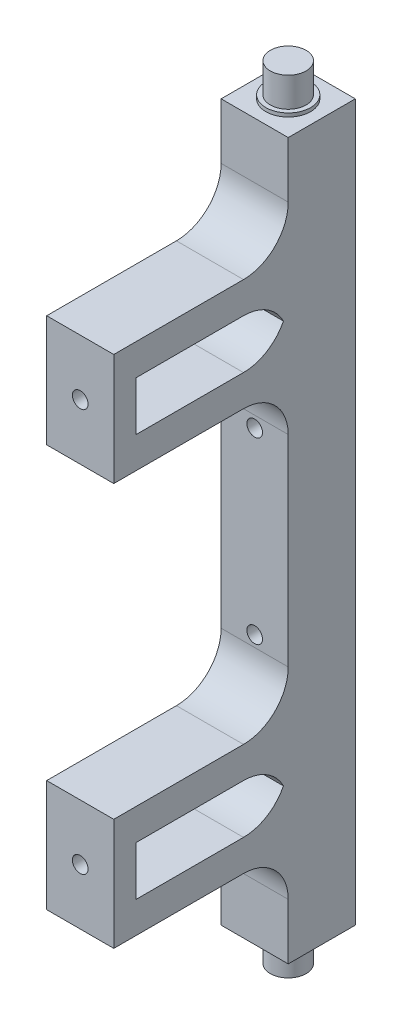
ISO-10303-21;
HEADER;
FILE_DESCRIPTION(('STEP AP214'),'2;1');
FILE_NAME('part.step','',(''),(''),'','','');
FILE_SCHEMA(('AUTOMOTIVE_DESIGN { 1 0 10303 214 1 1 1 1 }'));
ENDSEC;
DATA;
#1=APPLICATION_CONTEXT('core data for automotive mechanical design processes');
#2=APPLICATION_PROTOCOL_DEFINITION('international standard','automotive_design',2000,#1);
#3=PRODUCT_CONTEXT('',#1,'mechanical');
#4=PRODUCT('Part','Part','',(#3));
#5=PRODUCT_RELATED_PRODUCT_CATEGORY('part','',(#4));
#6=PRODUCT_DEFINITION_FORMATION('','',#4);
#7=PRODUCT_DEFINITION_CONTEXT('part definition',#1,'design');
#8=PRODUCT_DEFINITION('design','',#6,#7);
#9=PRODUCT_DEFINITION_SHAPE('','',#8);
#10=(LENGTH_UNIT() NAMED_UNIT(*) SI_UNIT(.MILLI.,.METRE.));
#11=(NAMED_UNIT(*) PLANE_ANGLE_UNIT() SI_UNIT($,.RADIAN.));
#12=(NAMED_UNIT(*) SI_UNIT($,.STERADIAN.) SOLID_ANGLE_UNIT());
#13=UNCERTAINTY_MEASURE_WITH_UNIT(LENGTH_MEASURE(1.E-05),#10,'distance_accuracy_value','');
#14=(GEOMETRIC_REPRESENTATION_CONTEXT(3) GLOBAL_UNCERTAINTY_ASSIGNED_CONTEXT((#13)) GLOBAL_UNIT_ASSIGNED_CONTEXT((#10,
#11,#12)) REPRESENTATION_CONTEXT('',''));
#15=CARTESIAN_POINT('',(0.,0.,0.));
#16=DIRECTION('',(0.,0.,1.));
#17=DIRECTION('',(1.,0.,0.));
#18=AXIS2_PLACEMENT_3D('',#15,#16,#17);
#19=CARTESIAN_POINT('',(0.,0.,0.));
#20=DIRECTION('',(0.,0.,-1.));
#21=DIRECTION('',(-1.,0.,0.));
#22=AXIS2_PLACEMENT_3D('',#19,#20,#21);
#23=PLANE('',#22);
#24=DIRECTION('',(0.,-1.,0.));
#25=VECTOR('',#24,1.);
#26=CARTESIAN_POINT('',(-7.5,-80.,0.));
#27=LINE('',#26,#25);
#28=CARTESIAN_POINT('',(-7.5,80.,0.));
#29=VERTEX_POINT('',#28);
#30=CARTESIAN_POINT('',(-7.5,67.5,0.));
#31=VERTEX_POINT('',#30);
#32=EDGE_CURVE('E341',#29,#31,#27,.T.);
#33=ORIENTED_EDGE('',*,*,#32,.T.);
#34=DIRECTION('',(-1.,0.,0.));
#35=VECTOR('',#34,1.);
#36=CARTESIAN_POINT('',(7.50000000000009,67.5,0.));
#37=LINE('',#36,#35);
#38=CARTESIAN_POINT('',(7.5,67.5,0.));
#39=VERTEX_POINT('',#38);
#40=EDGE_CURVE('E400',#31,#39,#37,.F.);
#41=ORIENTED_EDGE('',*,*,#40,.T.);
#42=DIRECTION('',(0.,1.,0.));
#43=VECTOR('',#42,1.);
#44=CARTESIAN_POINT('',(7.5,-80.,0.));
#45=LINE('',#44,#43);
#46=CARTESIAN_POINT('',(7.5,80.,0.));
#47=VERTEX_POINT('',#46);
#48=EDGE_CURVE('E348',#39,#47,#45,.T.);
#49=ORIENTED_EDGE('',*,*,#48,.T.);
#50=DIRECTION('',(-1.,0.,0.));
#51=VECTOR('',#50,1.);
#52=CARTESIAN_POINT('',(7.5,80.,0.));
#53=LINE('',#52,#51);
#54=EDGE_CURVE('E323',#47,#29,#53,.T.);
#55=ORIENTED_EDGE('',*,*,#54,.T.);
#56=EDGE_LOOP('',(#33,#41,#49,#55));
#57=FACE_BOUND('',#56,.T.);
#58=ADVANCED_FACE('F55',(#57),#23,.F.);
#59=CARTESIAN_POINT('',(0.,20.,0.));
#60=DIRECTION('',(0.,0.,1.));
#61=DIRECTION('',(1.,0.,0.));
#62=AXIS2_PLACEMENT_3D('',#59,#60,#61);
#63=CIRCLE('',#62,1.75);
#64=CARTESIAN_POINT('',(1.75,20.,0.));
#65=VERTEX_POINT('',#64);
#66=EDGE_CURVE('E936',#65,#65,#63,.T.);
#67=ORIENTED_EDGE('',*,*,#66,.F.);
#68=EDGE_LOOP('',(#67));
#69=FACE_BOUND('',#68,.T.);
#70=CARTESIAN_POINT('',(0.,-20.,0.));
#71=DIRECTION('',(0.,0.,1.));
#72=DIRECTION('',(1.,0.,0.));
#73=AXIS2_PLACEMENT_3D('',#70,#71,#72);
#74=CIRCLE('',#73,1.75);
#75=CARTESIAN_POINT('',(1.75,-20.,0.));
#76=VERTEX_POINT('',#75);
#77=EDGE_CURVE('E937',#76,#76,#74,.T.);
#78=ORIENTED_EDGE('',*,*,#77,.F.);
#79=EDGE_LOOP('',(#78));
#80=FACE_BOUND('',#79,.T.);
#81=CARTESIAN_POINT('',(-7.5,22.5,0.));
#82=VERTEX_POINT('',#81);
#83=CARTESIAN_POINT('',(-7.5,-22.5,0.));
#84=VERTEX_POINT('',#83);
#85=EDGE_CURVE('E345',#82,#84,#27,.T.);
#86=ORIENTED_EDGE('',*,*,#85,.T.);
#87=DIRECTION('',(-1.,0.,0.));
#88=VECTOR('',#87,1.);
#89=CARTESIAN_POINT('',(7.49999999999993,-22.4999999999999,0.));
#90=LINE('',#89,#88);
#91=CARTESIAN_POINT('',(7.5,-22.4999999999999,0.));
#92=VERTEX_POINT('',#91);
#93=EDGE_CURVE('E390',#84,#92,#90,.F.);
#94=ORIENTED_EDGE('',*,*,#93,.T.);
#95=CARTESIAN_POINT('',(7.5,22.4999999999999,0.));
#96=VERTEX_POINT('',#95);
#97=EDGE_CURVE('E351',#92,#96,#45,.T.);
#98=ORIENTED_EDGE('',*,*,#97,.T.);
#99=DIRECTION('',(1.,0.,0.));
#100=VECTOR('',#99,1.);
#101=CARTESIAN_POINT('',(-7.50000000000007,22.5,0.));
#102=LINE('',#101,#100);
#103=EDGE_CURVE('E388',#96,#82,#102,.F.);
#104=ORIENTED_EDGE('',*,*,#103,.T.);
#105=EDGE_LOOP('',(#86,#94,#98,#104));
#106=FACE_BOUND('',#105,.T.);
#107=ADVANCED_FACE('F485',(#69,#80,#106),#23,.F.);
#108=CARTESIAN_POINT('',(-7.4999999999999,-32.5,39.));
#109=DIRECTION('',(0.,-1.,0.));
#110=DIRECTION('',(1.,0.,0.));
#111=AXIS2_PLACEMENT_3D('',#108,#109,#110);
#112=PLANE('',#111);
#113=DIRECTION('',(0.,0.,-1.));
#114=VECTOR('',#113,1.);
#115=CARTESIAN_POINT('',(7.5000000000001,-32.4999999999999,39.));
#116=LINE('',#115,#114);
#117=CARTESIAN_POINT('',(7.5000000000001,-32.4999999999999,39.));
#118=VERTEX_POINT('',#117);
#119=CARTESIAN_POINT('',(7.5000000000001,-32.4999999999999,10.));
#120=VERTEX_POINT('',#119);
#121=EDGE_CURVE('E370',#118,#120,#116,.T.);
#122=ORIENTED_EDGE('',*,*,#121,.T.);
#123=DIRECTION('',(-1.,0.,0.));
#124=VECTOR('',#123,1.);
#125=CARTESIAN_POINT('',(-7.5,-32.5,10.));
#126=LINE('',#125,#124);
#127=CARTESIAN_POINT('',(-7.4999999999999,-32.5,10.));
#128=VERTEX_POINT('',#127);
#129=EDGE_CURVE('E385',#120,#128,#126,.T.);
#130=ORIENTED_EDGE('',*,*,#129,.T.);
#131=DIRECTION('',(0.,0.,-1.));
#132=VECTOR('',#131,1.);
#133=CARTESIAN_POINT('',(-7.4999999999999,-32.5,39.));
#134=LINE('',#133,#132);
#135=CARTESIAN_POINT('',(-7.4999999999999,-32.5,39.));
#136=VERTEX_POINT('',#135);
#137=EDGE_CURVE('E379',#136,#128,#134,.T.);
#138=ORIENTED_EDGE('',*,*,#137,.F.);
#139=DIRECTION('',(-1.,0.,0.));
#140=VECTOR('',#139,1.);
#141=CARTESIAN_POINT('',(-7.4999999999999,-32.5,39.));
#142=LINE('',#141,#140);
#143=EDGE_CURVE('E355',#118,#136,#142,.T.);
#144=ORIENTED_EDGE('',*,*,#143,.F.);
#145=EDGE_LOOP('',(#122,#130,#138,#144));
#146=FACE_BOUND('',#145,.T.);
#147=ADVANCED_FACE('F494',(#146),#112,.F.);
#148=CARTESIAN_POINT('',(-7.4999999999999,-57.5,39.));
#149=DIRECTION('',(1.,0.,0.));
#150=DIRECTION('',(0.,0.,-1.));
#151=AXIS2_PLACEMENT_3D('',#148,#149,#150);
#152=PLANE('',#151);
#153=DIRECTION('',(0.,0.,1.));
#154=VECTOR('',#153,1.);
#155=CARTESIAN_POINT('',(-7.4999999999999,-50.5,34.));
#156=LINE('',#155,#154);
#157=CARTESIAN_POINT('',(-7.4999999999999,-50.5,10.));
#158=VERTEX_POINT('',#157);
#159=CARTESIAN_POINT('',(-7.4999999999999,-50.5,34.));
#160=VERTEX_POINT('',#159);
#161=EDGE_CURVE('E241',#158,#160,#156,.T.);
#162=ORIENTED_EDGE('',*,*,#161,.F.);
#163=CARTESIAN_POINT('',(-7.4999999999999,-40.5,10.));
#164=DIRECTION('',(1.,0.,0.));
#165=DIRECTION('',(0.,0.,-1.));
#166=AXIS2_PLACEMENT_3D('',#163,#164,#165);
#167=CIRCLE('',#166,10.);
#168=CARTESIAN_POINT('',(-7.4999999999999,-45.,1.06971445025412));
#169=VERTEX_POINT('',#168);
#170=EDGE_CURVE('E64',#158,#169,#167,.T.);
#171=ORIENTED_EDGE('',*,*,#170,.T.);
#172=CARTESIAN_POINT('',(-7.4999999999999,-49.5,10.));
#173=DIRECTION('',(1.,0.,0.));
#174=DIRECTION('',(0.,0.,-1.));
#175=AXIS2_PLACEMENT_3D('',#172,#173,#174);
#176=CIRCLE('',#175,10.);
#177=CARTESIAN_POINT('',(-7.4999999999999,-39.5,9.99999999999999));
#178=VERTEX_POINT('',#177);
#179=EDGE_CURVE('E439',#169,#178,#176,.T.);
#180=ORIENTED_EDGE('',*,*,#179,.T.);
#181=DIRECTION('',(0.,0.,-1.));
#182=VECTOR('',#181,1.);
#183=CARTESIAN_POINT('',(-7.4999999999999,-39.5,34.));
#184=LINE('',#183,#182);
#185=CARTESIAN_POINT('',(-7.4999999999999,-39.5,34.));
#186=VERTEX_POINT('',#185);
#187=EDGE_CURVE('E252',#186,#178,#184,.T.);
#188=ORIENTED_EDGE('',*,*,#187,.F.);
#189=DIRECTION('',(0.,1.,0.));
#190=VECTOR('',#189,1.);
#191=CARTESIAN_POINT('',(-7.4999999999999,-39.5,34.));
#192=LINE('',#191,#190);
#193=EDGE_CURVE('E257',#160,#186,#192,.T.);
#194=ORIENTED_EDGE('',*,*,#193,.F.);
#195=EDGE_LOOP('',(#162,#171,#180,#188,#194));
#196=FACE_BOUND('',#195,.T.);
#197=DIRECTION('',(0.,0.,-1.));
#198=VECTOR('',#197,1.);
#199=CARTESIAN_POINT('',(-7.4999999999999,50.5,34.));
#200=LINE('',#199,#198);
#201=CARTESIAN_POINT('',(-7.4999999999999,50.5,34.));
#202=VERTEX_POINT('',#201);
#203=CARTESIAN_POINT('',(-7.4999999999999,50.5,9.99999999999999));
#204=VERTEX_POINT('',#203);
#205=EDGE_CURVE('E271',#202,#204,#200,.T.);
#206=ORIENTED_EDGE('',*,*,#205,.F.);
#207=DIRECTION('',(0.,1.,0.));
#208=VECTOR('',#207,1.);
#209=CARTESIAN_POINT('',(-7.4999999999999,39.5,34.));
#210=LINE('',#209,#208);
#211=CARTESIAN_POINT('',(-7.4999999999999,39.5,34.));
#212=VERTEX_POINT('',#211);
#213=EDGE_CURVE('E255',#212,#202,#210,.T.);
#214=ORIENTED_EDGE('',*,*,#213,.F.);
#215=DIRECTION('',(0.,0.,1.));
#216=VECTOR('',#215,1.);
#217=CARTESIAN_POINT('',(-7.4999999999999,39.5,34.));
#218=LINE('',#217,#216);
#219=CARTESIAN_POINT('',(-7.4999999999999,39.5,10.));
#220=VERTEX_POINT('',#219);
#221=EDGE_CURVE('E269',#220,#212,#218,.T.);
#222=ORIENTED_EDGE('',*,*,#221,.F.);
#223=CARTESIAN_POINT('',(-7.4999999999999,49.5,10.));
#224=DIRECTION('',(1.,0.,0.));
#225=DIRECTION('',(0.,0.,-1.));
#226=AXIS2_PLACEMENT_3D('',#223,#224,#225);
#227=CIRCLE('',#226,10.);
#228=CARTESIAN_POINT('',(-7.4999999999999,45.,1.06971445025412));
#229=VERTEX_POINT('',#228);
#230=EDGE_CURVE('E431',#220,#229,#227,.T.);
#231=ORIENTED_EDGE('',*,*,#230,.T.);
#232=CARTESIAN_POINT('',(-7.4999999999999,40.5,10.));
#233=DIRECTION('',(1.,0.,0.));
#234=DIRECTION('',(0.,0.,-1.));
#235=AXIS2_PLACEMENT_3D('',#232,#233,#234);
#236=CIRCLE('',#235,10.);
#237=EDGE_CURVE('E435',#229,#204,#236,.T.);
#238=ORIENTED_EDGE('',*,*,#237,.T.);
#239=EDGE_LOOP('',(#206,#214,#222,#231,#238));
#240=FACE_BOUND('',#239,.T.);
#241=ORIENTED_EDGE('',*,*,#137,.T.);
#242=CARTESIAN_POINT('',(-7.4999999999999,-22.5,10.));
#243=DIRECTION('',(1.,0.,0.));
#244=DIRECTION('',(0.,0.,-1.));
#245=AXIS2_PLACEMENT_3D('',#242,#243,#244);
#246=CIRCLE('',#245,10.);
#247=EDGE_CURVE('E405',#128,#84,#246,.T.);
#248=ORIENTED_EDGE('',*,*,#247,.T.);
#249=ORIENTED_EDGE('',*,*,#85,.F.);
#250=CARTESIAN_POINT('',(-7.4999999999999,22.5,10.));
#251=DIRECTION('',(1.,0.,0.));
#252=DIRECTION('',(0.,0.,-1.));
#253=AXIS2_PLACEMENT_3D('',#250,#251,#252);
#254=CIRCLE('',#253,10.);
#255=CARTESIAN_POINT('',(-7.49999999999991,32.5,10.));
#256=VERTEX_POINT('',#255);
#257=EDGE_CURVE('E419',#82,#256,#254,.T.);
#258=ORIENTED_EDGE('',*,*,#257,.T.);
#259=DIRECTION('',(0.,0.,-1.));
#260=VECTOR('',#259,1.);
#261=CARTESIAN_POINT('',(-7.49999999999991,32.5,39.));
#262=LINE('',#261,#260);
#263=CARTESIAN_POINT('',(-7.49999999999991,32.5,39.));
#264=VERTEX_POINT('',#263);
#265=EDGE_CURVE('E305',#264,#256,#262,.T.);
#266=ORIENTED_EDGE('',*,*,#265,.F.);
#267=DIRECTION('',(0.,-1.,0.));
#268=VECTOR('',#267,1.);
#269=CARTESIAN_POINT('',(-7.49999999999991,57.5,39.));
#270=LINE('',#269,#268);
#271=CARTESIAN_POINT('',(-7.49999999999991,57.5,39.));
#272=VERTEX_POINT('',#271);
#273=EDGE_CURVE('E318',#272,#264,#270,.T.);
#274=ORIENTED_EDGE('',*,*,#273,.F.);
#275=DIRECTION('',(0.,0.,-1.));
#276=VECTOR('',#275,1.);
#277=CARTESIAN_POINT('',(-7.49999999999991,57.5,39.));
#278=LINE('',#277,#276);
#279=CARTESIAN_POINT('',(-7.49999999999991,57.5,10.));
#280=VERTEX_POINT('',#279);
#281=EDGE_CURVE('E300',#272,#280,#278,.T.);
#282=ORIENTED_EDGE('',*,*,#281,.T.);
#283=CARTESIAN_POINT('',(-7.4999999999999,67.5,10.));
#284=DIRECTION('',(1.,0.,0.));
#285=DIRECTION('',(0.,0.,-1.));
#286=AXIS2_PLACEMENT_3D('',#283,#284,#285);
#287=CIRCLE('',#286,10.);
#288=EDGE_CURVE('E413',#280,#31,#287,.T.);
#289=ORIENTED_EDGE('',*,*,#288,.T.);
#290=ORIENTED_EDGE('',*,*,#32,.F.);
#291=DIRECTION('',(0.,0.,1.));
#292=VECTOR('',#291,1.);
#293=CARTESIAN_POINT('',(-7.5,80.,-15.));
#294=LINE('',#293,#292);
#295=CARTESIAN_POINT('',(-7.5,80.,-15.));
#296=VERTEX_POINT('',#295);
#297=EDGE_CURVE('E337',#296,#29,#294,.T.);
#298=ORIENTED_EDGE('',*,*,#297,.F.);
#299=DIRECTION('',(0.,-1.,0.));
#300=VECTOR('',#299,1.);
#301=CARTESIAN_POINT('',(-7.5,-80.,-15.));
#302=LINE('',#301,#300);
#303=CARTESIAN_POINT('',(-7.5,-80.,-15.));
#304=VERTEX_POINT('',#303);
#305=EDGE_CURVE('E327',#296,#304,#302,.T.);
#306=ORIENTED_EDGE('',*,*,#305,.T.);
#307=DIRECTION('',(0.,0.,1.));
#308=VECTOR('',#307,1.);
#309=CARTESIAN_POINT('',(-7.5,-80.,-15.));
#310=LINE('',#309,#308);
#311=CARTESIAN_POINT('',(-7.5,-80.,0.));
#312=VERTEX_POINT('',#311);
#313=EDGE_CURVE('E358',#304,#312,#310,.T.);
#314=ORIENTED_EDGE('',*,*,#313,.T.);
#315=CARTESIAN_POINT('',(-7.5,-67.5,0.));
#316=VERTEX_POINT('',#315);
#317=EDGE_CURVE('E340',#316,#312,#27,.T.);
#318=ORIENTED_EDGE('',*,*,#317,.F.);
#319=CARTESIAN_POINT('',(-7.4999999999999,-67.5,10.));
#320=DIRECTION('',(1.,0.,0.));
#321=DIRECTION('',(0.,0.,-1.));
#322=AXIS2_PLACEMENT_3D('',#319,#320,#321);
#323=CIRCLE('',#322,10.);
#324=CARTESIAN_POINT('',(-7.4999999999999,-57.5,10.));
#325=VERTEX_POINT('',#324);
#326=EDGE_CURVE('E411',#316,#325,#323,.T.);
#327=ORIENTED_EDGE('',*,*,#326,.T.);
#328=DIRECTION('',(0.,0.,-1.));
#329=VECTOR('',#328,1.);
#330=CARTESIAN_POINT('',(-7.4999999999999,-57.5,39.));
#331=LINE('',#330,#329);
#332=CARTESIAN_POINT('',(-7.4999999999999,-57.5,39.));
#333=VERTEX_POINT('',#332);
#334=EDGE_CURVE('E376',#333,#325,#331,.T.);
#335=ORIENTED_EDGE('',*,*,#334,.F.);
#336=DIRECTION('',(0.,-1.,0.));
#337=VECTOR('',#336,1.);
#338=CARTESIAN_POINT('',(-7.4999999999999,-57.5,39.));
#339=LINE('',#338,#337);
#340=EDGE_CURVE('E364',#136,#333,#339,.T.);
#341=ORIENTED_EDGE('',*,*,#340,.F.);
#342=EDGE_LOOP('',(#241,#248,#249,#258,#266,#274,#282,#289,#290,#298,#306,#314,#318,#327,#335,#341));
#343=FACE_BOUND('',#342,.T.);
#344=ADVANCED_FACE('F472',(#196,#240,#343),#152,.F.);
#345=CARTESIAN_POINT('',(-7.4999999999999,-57.5,39.));
#346=DIRECTION('',(0.,1.,0.));
#347=DIRECTION('',(0.,0.,1.));
#348=AXIS2_PLACEMENT_3D('',#345,#346,#347);
#349=PLANE('',#348);
#350=ORIENTED_EDGE('',*,*,#334,.T.);
#351=DIRECTION('',(1.,0.,0.));
#352=VECTOR('',#351,1.);
#353=CARTESIAN_POINT('',(7.5000000000001,-57.5,10.));
#354=LINE('',#353,#352);
#355=CARTESIAN_POINT('',(7.5000000000001,-57.5,10.));
#356=VERTEX_POINT('',#355);
#357=EDGE_CURVE('E392',#325,#356,#354,.T.);
#358=ORIENTED_EDGE('',*,*,#357,.T.);
#359=DIRECTION('',(0.,0.,-1.));
#360=VECTOR('',#359,1.);
#361=CARTESIAN_POINT('',(7.5000000000001,-57.5,39.));
#362=LINE('',#361,#360);
#363=CARTESIAN_POINT('',(7.5000000000001,-57.5,39.));
#364=VERTEX_POINT('',#363);
#365=EDGE_CURVE('E373',#364,#356,#362,.T.);
#366=ORIENTED_EDGE('',*,*,#365,.F.);
#367=DIRECTION('',(1.,0.,0.));
#368=VECTOR('',#367,1.);
#369=CARTESIAN_POINT('',(-7.4999999999999,-57.5,39.));
#370=LINE('',#369,#368);
#371=EDGE_CURVE('E366',#333,#364,#370,.T.);
#372=ORIENTED_EDGE('',*,*,#371,.F.);
#373=EDGE_LOOP('',(#350,#358,#366,#372));
#374=FACE_BOUND('',#373,.T.);
#375=ADVANCED_FACE('F525',(#374),#349,.F.);
#376=CARTESIAN_POINT('',(7.5000000000001,-57.5,39.));
#377=DIRECTION('',(-1.,0.,0.));
#378=DIRECTION('',(0.,0.,1.));
#379=AXIS2_PLACEMENT_3D('',#376,#377,#378);
#380=PLANE('',#379);
#381=DIRECTION('',(0.,1.,0.));
#382=VECTOR('',#381,1.);
#383=CARTESIAN_POINT('',(7.5000000000001,-39.5,34.));
#384=LINE('',#383,#382);
#385=CARTESIAN_POINT('',(7.5000000000001,-50.5,34.));
#386=VERTEX_POINT('',#385);
#387=CARTESIAN_POINT('',(7.5000000000001,-39.5,34.));
#388=VERTEX_POINT('',#387);
#389=EDGE_CURVE('E233',#386,#388,#384,.T.);
#390=ORIENTED_EDGE('',*,*,#389,.T.);
#391=DIRECTION('',(0.,0.,-1.));
#392=VECTOR('',#391,1.);
#393=CARTESIAN_POINT('',(7.5000000000001,-39.5,34.));
#394=LINE('',#393,#392);
#395=CARTESIAN_POINT('',(7.5000000000001,-39.5,9.99999999999999));
#396=VERTEX_POINT('',#395);
#397=EDGE_CURVE('E236',#388,#396,#394,.T.);
#398=ORIENTED_EDGE('',*,*,#397,.T.);
#399=CARTESIAN_POINT('',(7.5000000000001,-49.5,10.));
#400=DIRECTION('',(-1.,0.,0.));
#401=DIRECTION('',(0.,0.,1.));
#402=AXIS2_PLACEMENT_3D('',#399,#400,#401);
#403=CIRCLE('',#402,10.);
#404=CARTESIAN_POINT('',(7.5000000000001,-45.,1.06971445025412));
#405=VERTEX_POINT('',#404);
#406=EDGE_CURVE('E71',#396,#405,#403,.T.);
#407=ORIENTED_EDGE('',*,*,#406,.T.);
#408=CARTESIAN_POINT('',(7.5000000000001,-40.5,10.));
#409=DIRECTION('',(-1.,0.,0.));
#410=DIRECTION('',(0.,0.,1.));
#411=AXIS2_PLACEMENT_3D('',#408,#409,#410);
#412=CIRCLE('',#411,10.);
#413=CARTESIAN_POINT('',(7.5000000000001,-50.5,10.));
#414=VERTEX_POINT('',#413);
#415=EDGE_CURVE('E12',#405,#414,#412,.T.);
#416=ORIENTED_EDGE('',*,*,#415,.T.);
#417=DIRECTION('',(0.,0.,1.));
#418=VECTOR('',#417,1.);
#419=CARTESIAN_POINT('',(7.5000000000001,-50.5,34.));
#420=LINE('',#419,#418);
#421=EDGE_CURVE('E228',#414,#386,#420,.T.);
#422=ORIENTED_EDGE('',*,*,#421,.T.);
#423=EDGE_LOOP('',(#390,#398,#407,#416,#422));
#424=FACE_BOUND('',#423,.T.);
#425=DIRECTION('',(0.,0.,-1.));
#426=VECTOR('',#425,1.);
#427=CARTESIAN_POINT('',(7.5000000000001,50.5,34.));
#428=LINE('',#427,#426);
#429=CARTESIAN_POINT('',(7.5000000000001,50.5,34.));
#430=VERTEX_POINT('',#429);
#431=CARTESIAN_POINT('',(7.5000000000001,50.5,9.99999999999999));
#432=VERTEX_POINT('',#431);
#433=EDGE_CURVE('E277',#430,#432,#428,.T.);
#434=ORIENTED_EDGE('',*,*,#433,.T.);
#435=CARTESIAN_POINT('',(7.5000000000001,40.5,10.));
#436=DIRECTION('',(-1.,0.,0.));
#437=DIRECTION('',(0.,0.,1.));
#438=AXIS2_PLACEMENT_3D('',#435,#436,#437);
#439=CIRCLE('',#438,10.);
#440=CARTESIAN_POINT('',(7.5000000000001,45.,1.06971445025412));
#441=VERTEX_POINT('',#440);
#442=EDGE_CURVE('E437',#432,#441,#439,.T.);
#443=ORIENTED_EDGE('',*,*,#442,.T.);
#444=CARTESIAN_POINT('',(7.5000000000001,49.5,10.));
#445=DIRECTION('',(-1.,0.,0.));
#446=DIRECTION('',(0.,0.,1.));
#447=AXIS2_PLACEMENT_3D('',#444,#445,#446);
#448=CIRCLE('',#447,10.);
#449=CARTESIAN_POINT('',(7.5000000000001,39.5,10.));
#450=VERTEX_POINT('',#449);
#451=EDGE_CURVE('E433',#441,#450,#448,.T.);
#452=ORIENTED_EDGE('',*,*,#451,.T.);
#453=DIRECTION('',(0.,0.,1.));
#454=VECTOR('',#453,1.);
#455=CARTESIAN_POINT('',(7.5000000000001,39.5,34.));
#456=LINE('',#455,#454);
#457=CARTESIAN_POINT('',(7.5000000000001,39.5,34.));
#458=VERTEX_POINT('',#457);
#459=EDGE_CURVE('E264',#450,#458,#456,.T.);
#460=ORIENTED_EDGE('',*,*,#459,.T.);
#461=DIRECTION('',(0.,1.,0.));
#462=VECTOR('',#461,1.);
#463=CARTESIAN_POINT('',(7.5000000000001,39.5,34.));
#464=LINE('',#463,#462);
#465=EDGE_CURVE('E272',#458,#430,#464,.T.);
#466=ORIENTED_EDGE('',*,*,#465,.T.);
#467=EDGE_LOOP('',(#434,#443,#452,#460,#466));
#468=FACE_BOUND('',#467,.T.);
#469=ORIENTED_EDGE('',*,*,#365,.T.);
#470=CARTESIAN_POINT('',(7.5000000000001,-67.5,10.));
#471=DIRECTION('',(-1.,0.,0.));
#472=DIRECTION('',(0.,0.,1.));
#473=AXIS2_PLACEMENT_3D('',#470,#471,#472);
#474=CIRCLE('',#473,10.);
#475=CARTESIAN_POINT('',(7.5,-67.5,0.));
#476=VERTEX_POINT('',#475);
#477=EDGE_CURVE('E409',#356,#476,#474,.T.);
#478=ORIENTED_EDGE('',*,*,#477,.T.);
#479=CARTESIAN_POINT('',(7.5,-80.,0.));
#480=VERTEX_POINT('',#479);
#481=EDGE_CURVE('E328',#480,#476,#45,.T.);
#482=ORIENTED_EDGE('',*,*,#481,.F.);
#483=DIRECTION('',(0.,0.,1.));
#484=VECTOR('',#483,1.);
#485=CARTESIAN_POINT('',(7.5,-80.,-15.));
#486=LINE('',#485,#484);
#487=CARTESIAN_POINT('',(7.5,-80.,-15.));
#488=VERTEX_POINT('',#487);
#489=EDGE_CURVE('E356',#488,#480,#486,.T.);
#490=ORIENTED_EDGE('',*,*,#489,.F.);
#491=DIRECTION('',(0.,1.,0.));
#492=VECTOR('',#491,1.);
#493=CARTESIAN_POINT('',(7.5,-80.,-15.));
#494=LINE('',#493,#492);
#495=CARTESIAN_POINT('',(7.5,80.,-15.));
#496=VERTEX_POINT('',#495);
#497=EDGE_CURVE('E334',#488,#496,#494,.T.);
#498=ORIENTED_EDGE('',*,*,#497,.T.);
#499=DIRECTION('',(0.,0.,1.));
#500=VECTOR('',#499,1.);
#501=CARTESIAN_POINT('',(7.5,80.,-15.));
#502=LINE('',#501,#500);
#503=EDGE_CURVE('E352',#496,#47,#502,.T.);
#504=ORIENTED_EDGE('',*,*,#503,.T.);
#505=ORIENTED_EDGE('',*,*,#48,.F.);
#506=CARTESIAN_POINT('',(7.5000000000001,67.5,10.));
#507=DIRECTION('',(-1.,0.,0.));
#508=DIRECTION('',(0.,0.,1.));
#509=AXIS2_PLACEMENT_3D('',#506,#507,#508);
#510=CIRCLE('',#509,10.);
#511=CARTESIAN_POINT('',(7.50000000000009,57.5,10.));
#512=VERTEX_POINT('',#511);
#513=EDGE_CURVE('E415',#39,#512,#510,.T.);
#514=ORIENTED_EDGE('',*,*,#513,.T.);
#515=DIRECTION('',(0.,0.,-1.));
#516=VECTOR('',#515,1.);
#517=CARTESIAN_POINT('',(7.50000000000009,57.5,39.));
#518=LINE('',#517,#516);
#519=CARTESIAN_POINT('',(7.50000000000009,57.5,39.));
#520=VERTEX_POINT('',#519);
#521=EDGE_CURVE('E311',#520,#512,#518,.T.);
#522=ORIENTED_EDGE('',*,*,#521,.F.);
#523=DIRECTION('',(0.,1.,0.));
#524=VECTOR('',#523,1.);
#525=CARTESIAN_POINT('',(7.50000000000009,57.5,39.));
#526=LINE('',#525,#524);
#527=CARTESIAN_POINT('',(7.50000000000009,32.4999999999999,39.));
#528=VERTEX_POINT('',#527);
#529=EDGE_CURVE('E314',#528,#520,#526,.T.);
#530=ORIENTED_EDGE('',*,*,#529,.F.);
#531=DIRECTION('',(0.,0.,-1.));
#532=VECTOR('',#531,1.);
#533=CARTESIAN_POINT('',(7.50000000000009,32.4999999999999,39.));
#534=LINE('',#533,#532);
#535=CARTESIAN_POINT('',(7.50000000000009,32.4999999999999,10.));
#536=VERTEX_POINT('',#535);
#537=EDGE_CURVE('E308',#528,#536,#534,.T.);
#538=ORIENTED_EDGE('',*,*,#537,.T.);
#539=CARTESIAN_POINT('',(7.5000000000001,22.4999999999999,10.));
#540=DIRECTION('',(-1.,0.,0.));
#541=DIRECTION('',(0.,0.,1.));
#542=AXIS2_PLACEMENT_3D('',#539,#540,#541);
#543=CIRCLE('',#542,10.);
#544=EDGE_CURVE('E417',#536,#96,#543,.T.);
#545=ORIENTED_EDGE('',*,*,#544,.T.);
#546=ORIENTED_EDGE('',*,*,#97,.F.);
#547=CARTESIAN_POINT('',(7.5000000000001,-22.4999999999999,10.));
#548=DIRECTION('',(-1.,0.,0.));
#549=DIRECTION('',(0.,0.,1.));
#550=AXIS2_PLACEMENT_3D('',#547,#548,#549);
#551=CIRCLE('',#550,10.);
#552=EDGE_CURVE('E407',#92,#120,#551,.T.);
#553=ORIENTED_EDGE('',*,*,#552,.T.);
#554=ORIENTED_EDGE('',*,*,#121,.F.);
#555=DIRECTION('',(0.,1.,0.));
#556=VECTOR('',#555,1.);
#557=CARTESIAN_POINT('',(7.5000000000001,-57.5,39.));
#558=LINE('',#557,#556);
#559=EDGE_CURVE('E368',#364,#118,#558,.T.);
#560=ORIENTED_EDGE('',*,*,#559,.F.);
#561=EDGE_LOOP('',(#469,#478,#482,#490,#498,#504,#505,#514,#522,#530,#538,#545,#546,#553,#554,#560));
#562=FACE_BOUND('',#561,.T.);
#563=ADVANCED_FACE('F230',(#424,#468,#562),#380,.F.);
#564=CARTESIAN_POINT('',(0.,0.,39.));
#565=DIRECTION('',(0.,0.,1.));
#566=DIRECTION('',(1.,0.,0.));
#567=AXIS2_PLACEMENT_3D('',#564,#565,#566);
#568=PLANE('',#567);
#569=CARTESIAN_POINT('',(0.,-44.9999999999999,39.));
#570=DIRECTION('',(0.,0.,-1.));
#571=DIRECTION('',(-1.,0.,0.));
#572=AXIS2_PLACEMENT_3D('',#569,#570,#571);
#573=CIRCLE('',#572,1.75);
#574=CARTESIAN_POINT('',(-1.75,-44.9999999999999,39.));
#575=VERTEX_POINT('',#574);
#576=EDGE_CURVE('E447',#575,#575,#573,.T.);
#577=ORIENTED_EDGE('',*,*,#576,.T.);
#578=EDGE_LOOP('',(#577));
#579=FACE_BOUND('',#578,.T.);
#580=ORIENTED_EDGE('',*,*,#143,.T.);
#581=ORIENTED_EDGE('',*,*,#340,.T.);
#582=ORIENTED_EDGE('',*,*,#371,.T.);
#583=ORIENTED_EDGE('',*,*,#559,.T.);
#584=EDGE_LOOP('',(#580,#581,#582,#583));
#585=FACE_BOUND('',#584,.T.);
#586=ADVANCED_FACE('F529',(#579,#585),#568,.T.);
#587=CARTESIAN_POINT('',(7.5,80.,-15.));
#588=DIRECTION('',(0.,1.,0.));
#589=DIRECTION('',(0.,0.,1.));
#590=AXIS2_PLACEMENT_3D('',#587,#588,#589);
#591=PLANE('',#590);
#592=CARTESIAN_POINT('',(0.,80.,-7.5));
#593=DIRECTION('',(0.,1.,0.));
#594=DIRECTION('',(0.,0.,1.));
#595=AXIS2_PLACEMENT_3D('',#592,#593,#594);
#596=CIRCLE('',#595,5.);
#597=CARTESIAN_POINT('',(0.,80.,-2.5));
#598=VERTEX_POINT('',#597);
#599=EDGE_CURVE('E382',#598,#598,#596,.T.);
#600=ORIENTED_EDGE('',*,*,#599,.F.);
#601=EDGE_LOOP('',(#600));
#602=FACE_BOUND('',#601,.T.);
#603=ORIENTED_EDGE('',*,*,#54,.F.);
#604=ORIENTED_EDGE('',*,*,#503,.F.);
#605=DIRECTION('',(-1.,0.,0.));
#606=VECTOR('',#605,1.);
#607=CARTESIAN_POINT('',(7.5,80.,-15.));
#608=LINE('',#607,#606);
#609=EDGE_CURVE('E324',#496,#296,#608,.T.);
#610=ORIENTED_EDGE('',*,*,#609,.T.);
#611=ORIENTED_EDGE('',*,*,#297,.T.);
#612=EDGE_LOOP('',(#603,#604,#610,#611));
#613=FACE_BOUND('',#612,.T.);
#614=ADVANCED_FACE('F552',(#602,#613),#591,.T.);
#615=CARTESIAN_POINT('',(7.5,-80.,-15.));
#616=DIRECTION('',(0.,-1.,0.));
#617=DIRECTION('',(0.,0.,-1.));
#618=AXIS2_PLACEMENT_3D('',#615,#616,#617);
#619=PLANE('',#618);
#620=CARTESIAN_POINT('',(0.,-80.,-7.5));
#621=DIRECTION('',(0.,-1.,0.));
#622=DIRECTION('',(0.,0.,-1.));
#623=AXIS2_PLACEMENT_3D('',#620,#621,#622);
#624=CIRCLE('',#623,5.);
#625=CARTESIAN_POINT('',(0.,-80.,-12.5));
#626=VERTEX_POINT('',#625);
#627=EDGE_CURVE('E296',#626,#626,#624,.T.);
#628=ORIENTED_EDGE('',*,*,#627,.F.);
#629=EDGE_LOOP('',(#628));
#630=FACE_BOUND('',#629,.T.);
#631=DIRECTION('',(1.,0.,0.));
#632=VECTOR('',#631,1.);
#633=CARTESIAN_POINT('',(7.5,-80.,0.));
#634=LINE('',#633,#632);
#635=EDGE_CURVE('E344',#312,#480,#634,.T.);
#636=ORIENTED_EDGE('',*,*,#635,.F.);
#637=ORIENTED_EDGE('',*,*,#313,.F.);
#638=DIRECTION('',(1.,0.,0.));
#639=VECTOR('',#638,1.);
#640=CARTESIAN_POINT('',(7.5,-80.,-15.));
#641=LINE('',#640,#639);
#642=EDGE_CURVE('E331',#304,#488,#641,.T.);
#643=ORIENTED_EDGE('',*,*,#642,.T.);
#644=ORIENTED_EDGE('',*,*,#489,.T.);
#645=EDGE_LOOP('',(#636,#637,#643,#644));
#646=FACE_BOUND('',#645,.T.);
#647=ADVANCED_FACE('F510',(#630,#646),#619,.T.);
#648=CARTESIAN_POINT('',(0.,0.,-15.));
#649=DIRECTION('',(0.,0.,-1.));
#650=DIRECTION('',(-1.,0.,0.));
#651=AXIS2_PLACEMENT_3D('',#648,#649,#650);
#652=PLANE('',#651);
#653=CARTESIAN_POINT('',(0.,20.,-15.));
#654=DIRECTION('',(0.,0.,1.));
#655=DIRECTION('',(1.,0.,0.));
#656=AXIS2_PLACEMENT_3D('',#653,#654,#655);
#657=CIRCLE('',#656,1.75);
#658=CARTESIAN_POINT('',(1.75,20.,-15.));
#659=VERTEX_POINT('',#658);
#660=EDGE_CURVE('E466',#659,#659,#657,.T.);
#661=ORIENTED_EDGE('',*,*,#660,.T.);
#662=EDGE_LOOP('',(#661));
#663=FACE_BOUND('',#662,.T.);
#664=CARTESIAN_POINT('',(0.,-20.,-15.));
#665=DIRECTION('',(0.,0.,1.));
#666=DIRECTION('',(1.,0.,0.));
#667=AXIS2_PLACEMENT_3D('',#664,#665,#666);
#668=CIRCLE('',#667,1.75);
#669=CARTESIAN_POINT('',(1.75,-20.,-15.));
#670=VERTEX_POINT('',#669);
#671=EDGE_CURVE('E459',#670,#670,#668,.T.);
#672=ORIENTED_EDGE('',*,*,#671,.T.);
#673=EDGE_LOOP('',(#672));
#674=FACE_BOUND('',#673,.T.);
#675=ORIENTED_EDGE('',*,*,#609,.F.);
#676=ORIENTED_EDGE('',*,*,#497,.F.);
#677=ORIENTED_EDGE('',*,*,#642,.F.);
#678=ORIENTED_EDGE('',*,*,#305,.F.);
#679=EDGE_LOOP('',(#675,#676,#677,#678));
#680=FACE_BOUND('',#679,.T.);
#681=ADVANCED_FACE('F500',(#663,#674,#680),#652,.T.);
#682=ORIENTED_EDGE('',*,*,#481,.T.);
#683=DIRECTION('',(1.,0.,0.));
#684=VECTOR('',#683,1.);
#685=CARTESIAN_POINT('',(-7.5,-67.5,0.));
#686=LINE('',#685,#684);
#687=EDGE_CURVE('E395',#476,#316,#686,.F.);
#688=ORIENTED_EDGE('',*,*,#687,.T.);
#689=ORIENTED_EDGE('',*,*,#317,.T.);
#690=ORIENTED_EDGE('',*,*,#635,.T.);
#691=EDGE_LOOP('',(#682,#688,#689,#690));
#692=FACE_BOUND('',#691,.T.);
#693=ADVANCED_FACE('F488',(#692),#23,.F.);
#694=CARTESIAN_POINT('',(-7.49999999999991,57.5,39.));
#695=DIRECTION('',(0.,-1.,0.));
#696=DIRECTION('',(0.,0.,-1.));
#697=AXIS2_PLACEMENT_3D('',#694,#695,#696);
#698=PLANE('',#697);
#699=ORIENTED_EDGE('',*,*,#521,.T.);
#700=DIRECTION('',(-1.,0.,0.));
#701=VECTOR('',#700,1.);
#702=CARTESIAN_POINT('',(-7.5,57.5,10.));
#703=LINE('',#702,#701);
#704=EDGE_CURVE('E397',#512,#280,#703,.T.);
#705=ORIENTED_EDGE('',*,*,#704,.T.);
#706=ORIENTED_EDGE('',*,*,#281,.F.);
#707=DIRECTION('',(-1.,0.,0.));
#708=VECTOR('',#707,1.);
#709=CARTESIAN_POINT('',(-7.49999999999991,57.5,39.));
#710=LINE('',#709,#708);
#711=EDGE_CURVE('E320',#520,#272,#710,.T.);
#712=ORIENTED_EDGE('',*,*,#711,.F.);
#713=EDGE_LOOP('',(#699,#705,#706,#712));
#714=FACE_BOUND('',#713,.T.);
#715=ADVANCED_FACE('F499',(#714),#698,.F.);
#716=CARTESIAN_POINT('',(-7.49999999999991,32.5,39.));
#717=DIRECTION('',(0.,1.,0.));
#718=DIRECTION('',(-1.,0.,0.));
#719=AXIS2_PLACEMENT_3D('',#716,#717,#718);
#720=PLANE('',#719);
#721=ORIENTED_EDGE('',*,*,#265,.T.);
#722=DIRECTION('',(1.,0.,0.));
#723=VECTOR('',#722,1.);
#724=CARTESIAN_POINT('',(7.5,32.4999999999999,10.));
#725=LINE('',#724,#723);
#726=EDGE_CURVE('E402',#256,#536,#725,.T.);
#727=ORIENTED_EDGE('',*,*,#726,.T.);
#728=ORIENTED_EDGE('',*,*,#537,.F.);
#729=DIRECTION('',(1.,0.,0.));
#730=VECTOR('',#729,1.);
#731=CARTESIAN_POINT('',(-7.49999999999991,32.5,39.));
#732=LINE('',#731,#730);
#733=EDGE_CURVE('E316',#264,#528,#732,.T.);
#734=ORIENTED_EDGE('',*,*,#733,.F.);
#735=EDGE_LOOP('',(#721,#727,#728,#734));
#736=FACE_BOUND('',#735,.T.);
#737=ADVANCED_FACE('F506',(#736),#720,.F.);
#738=CARTESIAN_POINT('',(0.,0.,39.));
#739=DIRECTION('',(0.,0.,-1.));
#740=DIRECTION('',(-1.,0.,0.));
#741=AXIS2_PLACEMENT_3D('',#738,#739,#740);
#742=PLANE('',#741);
#743=CARTESIAN_POINT('',(0.,44.9999999999999,39.));
#744=DIRECTION('',(0.,0.,-1.));
#745=DIRECTION('',(1.,0.,0.));
#746=AXIS2_PLACEMENT_3D('',#743,#744,#745);
#747=CIRCLE('',#746,1.75);
#748=CARTESIAN_POINT('',(1.75,44.9999999999999,39.));
#749=VERTEX_POINT('',#748);
#750=EDGE_CURVE('E464',#749,#749,#747,.T.);
#751=ORIENTED_EDGE('',*,*,#750,.T.);
#752=EDGE_LOOP('',(#751));
#753=FACE_BOUND('',#752,.T.);
#754=ORIENTED_EDGE('',*,*,#711,.T.);
#755=ORIENTED_EDGE('',*,*,#273,.T.);
#756=ORIENTED_EDGE('',*,*,#733,.T.);
#757=ORIENTED_EDGE('',*,*,#529,.T.);
#758=EDGE_LOOP('',(#754,#755,#756,#757));
#759=FACE_BOUND('',#758,.T.);
#760=ADVANCED_FACE('F563',(#753,#759),#742,.F.);
#761=CARTESIAN_POINT('',(0.,-80.8,-7.5));
#762=DIRECTION('',(0.,-1.,0.));
#763=DIRECTION('',(0.,0.,-1.));
#764=AXIS2_PLACEMENT_3D('',#761,#762,#763);
#765=PLANE('',#764);
#766=CARTESIAN_POINT('',(0.,-80.8,-7.5));
#767=DIRECTION('',(0.,-1.,0.));
#768=DIRECTION('',(0.,0.,-1.));
#769=AXIS2_PLACEMENT_3D('',#766,#767,#768);
#770=CIRCLE('',#769,5.);
#771=CARTESIAN_POINT('',(0.,-80.8,-12.5));
#772=VERTEX_POINT('',#771);
#773=EDGE_CURVE('E297',#772,#772,#770,.T.);
#774=ORIENTED_EDGE('',*,*,#773,.T.);
#775=EDGE_LOOP('',(#774));
#776=FACE_BOUND('',#775,.T.);
#777=CARTESIAN_POINT('',(0.,-80.8,-7.5));
#778=DIRECTION('',(0.,-1.,0.));
#779=DIRECTION('',(0.,0.,-1.));
#780=AXIS2_PLACEMENT_3D('',#777,#778,#779);
#781=CIRCLE('',#780,4.);
#782=CARTESIAN_POINT('',(0.,-80.8,-11.5));
#783=VERTEX_POINT('',#782);
#784=EDGE_CURVE('E293',#783,#783,#781,.T.);
#785=ORIENTED_EDGE('',*,*,#784,.F.);
#786=EDGE_LOOP('',(#785));
#787=FACE_BOUND('',#786,.T.);
#788=ADVANCED_FACE('F658',(#776,#787),#765,.T.);
#789=CARTESIAN_POINT('',(0.,-80.8,-7.5));
#790=DIRECTION('',(0.,1.,0.));
#791=DIRECTION('',(0.,0.,1.));
#792=AXIS2_PLACEMENT_3D('',#789,#790,#791);
#793=CYLINDRICAL_SURFACE('',#792,5.);
#794=ORIENTED_EDGE('',*,*,#773,.F.);
#795=EDGE_LOOP('',(#794));
#796=FACE_BOUND('',#795,.T.);
#797=ORIENTED_EDGE('',*,*,#627,.T.);
#798=EDGE_LOOP('',(#797));
#799=FACE_BOUND('',#798,.T.);
#800=ADVANCED_FACE('F656',(#796,#799),#793,.T.);
#801=CARTESIAN_POINT('',(0.,-87.4,-7.5));
#802=DIRECTION('',(0.,1.,0.));
#803=DIRECTION('',(0.,0.,1.));
#804=AXIS2_PLACEMENT_3D('',#801,#802,#803);
#805=CYLINDRICAL_SURFACE('',#804,4.);
#806=ORIENTED_EDGE('',*,*,#784,.T.);
#807=EDGE_LOOP('',(#806));
#808=FACE_BOUND('',#807,.T.);
#809=CARTESIAN_POINT('',(0.,-87.4,-7.5));
#810=DIRECTION('',(0.,-1.,0.));
#811=DIRECTION('',(0.,0.,-1.));
#812=AXIS2_PLACEMENT_3D('',#809,#810,#811);
#813=CIRCLE('',#812,4.);
#814=CARTESIAN_POINT('',(0.,-87.4,-11.5));
#815=VERTEX_POINT('',#814);
#816=EDGE_CURVE('E290',#815,#815,#813,.T.);
#817=ORIENTED_EDGE('',*,*,#816,.F.);
#818=EDGE_LOOP('',(#817));
#819=FACE_BOUND('',#818,.T.);
#820=ADVANCED_FACE('F652',(#808,#819),#805,.T.);
#821=CARTESIAN_POINT('',(0.,-87.4,0.));
#822=DIRECTION('',(0.,-1.,0.));
#823=DIRECTION('',(0.,0.,-1.));
#824=AXIS2_PLACEMENT_3D('',#821,#822,#823);
#825=PLANE('',#824);
#826=ORIENTED_EDGE('',*,*,#816,.T.);
#827=EDGE_LOOP('',(#826));
#828=FACE_BOUND('',#827,.T.);
#829=ADVANCED_FACE('F648',(#828),#825,.T.);
#830=CARTESIAN_POINT('',(0.,80.8,-7.5));
#831=DIRECTION('',(0.,-1.,0.));
#832=DIRECTION('',(0.,0.,-1.));
#833=AXIS2_PLACEMENT_3D('',#830,#831,#832);
#834=CYLINDRICAL_SURFACE('',#833,5.);
#835=CARTESIAN_POINT('',(0.,80.8,-7.5));
#836=DIRECTION('',(0.,-1.,0.));
#837=DIRECTION('',(0.,0.,-1.));
#838=AXIS2_PLACEMENT_3D('',#835,#836,#837);
#839=CIRCLE('',#838,5.);
#840=CARTESIAN_POINT('',(0.,80.8,-12.5));
#841=VERTEX_POINT('',#840);
#842=EDGE_CURVE('E287',#841,#841,#839,.T.);
#843=ORIENTED_EDGE('',*,*,#842,.T.);
#844=EDGE_LOOP('',(#843));
#845=FACE_BOUND('',#844,.T.);
#846=ORIENTED_EDGE('',*,*,#599,.T.);
#847=EDGE_LOOP('',(#846));
#848=FACE_BOUND('',#847,.T.);
#849=ADVANCED_FACE('F644',(#845,#848),#834,.T.);
#850=CARTESIAN_POINT('',(0.,80.8,-7.5));
#851=DIRECTION('',(0.,1.,0.));
#852=DIRECTION('',(0.,0.,-1.));
#853=AXIS2_PLACEMENT_3D('',#850,#851,#852);
#854=PLANE('',#853);
#855=CARTESIAN_POINT('',(0.,80.8,-7.5));
#856=DIRECTION('',(0.,1.,0.));
#857=DIRECTION('',(0.,0.,1.));
#858=AXIS2_PLACEMENT_3D('',#855,#856,#857);
#859=CIRCLE('',#858,4.);
#860=CARTESIAN_POINT('',(0.,80.8,-3.5));
#861=VERTEX_POINT('',#860);
#862=EDGE_CURVE('E284',#861,#861,#859,.T.);
#863=ORIENTED_EDGE('',*,*,#862,.F.);
#864=EDGE_LOOP('',(#863));
#865=FACE_BOUND('',#864,.T.);
#866=ORIENTED_EDGE('',*,*,#842,.F.);
#867=EDGE_LOOP('',(#866));
#868=FACE_BOUND('',#867,.T.);
#869=ADVANCED_FACE('F640',(#865,#868),#854,.T.);
#870=CARTESIAN_POINT('',(0.,87.4,-7.5));
#871=DIRECTION('',(0.,-1.,0.));
#872=DIRECTION('',(0.,0.,-1.));
#873=AXIS2_PLACEMENT_3D('',#870,#871,#872);
#874=CYLINDRICAL_SURFACE('',#873,4.);
#875=ORIENTED_EDGE('',*,*,#862,.T.);
#876=EDGE_LOOP('',(#875));
#877=FACE_BOUND('',#876,.T.);
#878=CARTESIAN_POINT('',(0.,87.4,-7.5));
#879=DIRECTION('',(0.,-1.,0.));
#880=DIRECTION('',(0.,0.,-1.));
#881=AXIS2_PLACEMENT_3D('',#878,#879,#880);
#882=CIRCLE('',#881,4.);
#883=CARTESIAN_POINT('',(0.,87.4,-11.5));
#884=VERTEX_POINT('',#883);
#885=EDGE_CURVE('E259',#884,#884,#882,.T.);
#886=ORIENTED_EDGE('',*,*,#885,.T.);
#887=EDGE_LOOP('',(#886));
#888=FACE_BOUND('',#887,.T.);
#889=ADVANCED_FACE('F636',(#877,#888),#874,.T.);
#890=CARTESIAN_POINT('',(0.,87.4,0.));
#891=DIRECTION('',(0.,1.,0.));
#892=DIRECTION('',(0.,0.,-1.));
#893=AXIS2_PLACEMENT_3D('',#890,#891,#892);
#894=PLANE('',#893);
#895=ORIENTED_EDGE('',*,*,#885,.F.);
#896=EDGE_LOOP('',(#895));
#897=FACE_BOUND('',#896,.T.);
#898=ADVANCED_FACE('F595',(#897),#894,.T.);
#899=CARTESIAN_POINT('',(-7.49999999999997,-22.5,10.));
#900=DIRECTION('',(1.,0.,0.));
#901=DIRECTION('',(0.,1.,0.));
#902=AXIS2_PLACEMENT_3D('',#899,#900,#901);
#903=CYLINDRICAL_SURFACE('',#902,10.);
#904=ORIENTED_EDGE('',*,*,#552,.F.);
#905=ORIENTED_EDGE('',*,*,#93,.F.);
#906=ORIENTED_EDGE('',*,*,#247,.F.);
#907=ORIENTED_EDGE('',*,*,#129,.F.);
#908=EDGE_LOOP('',(#904,#905,#906,#907));
#909=FACE_BOUND('',#908,.T.);
#910=ADVANCED_FACE('F539',(#909),#903,.F.);
#911=CARTESIAN_POINT('',(-7.4999999999999,-67.5,10.));
#912=DIRECTION('',(-1.,0.,0.));
#913=DIRECTION('',(0.,0.,1.));
#914=AXIS2_PLACEMENT_3D('',#911,#912,#913);
#915=CYLINDRICAL_SURFACE('',#914,10.);
#916=ORIENTED_EDGE('',*,*,#326,.F.);
#917=ORIENTED_EDGE('',*,*,#687,.F.);
#918=ORIENTED_EDGE('',*,*,#477,.F.);
#919=ORIENTED_EDGE('',*,*,#357,.F.);
#920=EDGE_LOOP('',(#916,#917,#918,#919));
#921=FACE_BOUND('',#920,.T.);
#922=ADVANCED_FACE('F519',(#921),#915,.F.);
#923=CARTESIAN_POINT('',(-7.49999999999991,67.5,10.));
#924=DIRECTION('',(1.,0.,0.));
#925=DIRECTION('',(0.,0.,-1.));
#926=AXIS2_PLACEMENT_3D('',#923,#924,#925);
#927=CYLINDRICAL_SURFACE('',#926,10.);
#928=ORIENTED_EDGE('',*,*,#513,.F.);
#929=ORIENTED_EDGE('',*,*,#40,.F.);
#930=ORIENTED_EDGE('',*,*,#288,.F.);
#931=ORIENTED_EDGE('',*,*,#704,.F.);
#932=EDGE_LOOP('',(#928,#929,#930,#931));
#933=FACE_BOUND('',#932,.T.);
#934=ADVANCED_FACE('F556',(#933),#927,.F.);
#935=CARTESIAN_POINT('',(-7.49999999999998,22.5,10.));
#936=DIRECTION('',(-1.,0.,0.));
#937=DIRECTION('',(0.,-1.,0.));
#938=AXIS2_PLACEMENT_3D('',#935,#936,#937);
#939=CYLINDRICAL_SURFACE('',#938,10.);
#940=ORIENTED_EDGE('',*,*,#257,.F.);
#941=ORIENTED_EDGE('',*,*,#103,.F.);
#942=ORIENTED_EDGE('',*,*,#544,.F.);
#943=ORIENTED_EDGE('',*,*,#726,.F.);
#944=EDGE_LOOP('',(#940,#941,#942,#943));
#945=FACE_BOUND('',#944,.T.);
#946=ADVANCED_FACE('F571',(#945),#939,.F.);
#947=CARTESIAN_POINT('',(7.5000000000001,39.5,34.));
#948=DIRECTION('',(0.,0.,1.));
#949=DIRECTION('',(1.,0.,0.));
#950=AXIS2_PLACEMENT_3D('',#947,#948,#949);
#951=PLANE('',#950);
#952=CARTESIAN_POINT('',(0.,44.9999999999999,34.));
#953=DIRECTION('',(0.,0.,-1.));
#954=DIRECTION('',(1.,0.,0.));
#955=AXIS2_PLACEMENT_3D('',#952,#953,#954);
#956=CIRCLE('',#955,1.75);
#957=CARTESIAN_POINT('',(1.75,44.9999999999999,34.));
#958=VERTEX_POINT('',#957);
#959=EDGE_CURVE('E456',#958,#958,#956,.T.);
#960=ORIENTED_EDGE('',*,*,#959,.F.);
#961=EDGE_LOOP('',(#960));
#962=FACE_BOUND('',#961,.T.);
#963=ORIENTED_EDGE('',*,*,#213,.T.);
#964=DIRECTION('',(-1.,0.,0.));
#965=VECTOR('',#964,1.);
#966=CARTESIAN_POINT('',(7.5000000000001,50.5,34.));
#967=LINE('',#966,#965);
#968=EDGE_CURVE('E261',#430,#202,#967,.T.);
#969=ORIENTED_EDGE('',*,*,#968,.F.);
#970=ORIENTED_EDGE('',*,*,#465,.F.);
#971=DIRECTION('',(-1.,0.,0.));
#972=VECTOR('',#971,1.);
#973=CARTESIAN_POINT('',(7.5000000000001,39.5,34.));
#974=LINE('',#973,#972);
#975=EDGE_CURVE('E265',#458,#212,#974,.T.);
#976=ORIENTED_EDGE('',*,*,#975,.T.);
#977=EDGE_LOOP('',(#963,#969,#970,#976));
#978=FACE_BOUND('',#977,.T.);
#979=ADVANCED_FACE('F601',(#962,#978),#951,.F.);
#980=CARTESIAN_POINT('',(7.5000000000001,39.5,34.));
#981=DIRECTION('',(0.,-1.,0.));
#982=DIRECTION('',(0.,0.,-1.));
#983=AXIS2_PLACEMENT_3D('',#980,#981,#982);
#984=PLANE('',#983);
#985=ORIENTED_EDGE('',*,*,#459,.F.);
#986=DIRECTION('',(-1.,0.,0.));
#987=VECTOR('',#986,1.);
#988=CARTESIAN_POINT('',(-7.4999999999999,39.5,10.));
#989=LINE('',#988,#987);
#990=EDGE_CURVE('E421',#450,#220,#989,.T.);
#991=ORIENTED_EDGE('',*,*,#990,.T.);
#992=ORIENTED_EDGE('',*,*,#221,.T.);
#993=ORIENTED_EDGE('',*,*,#975,.F.);
#994=EDGE_LOOP('',(#985,#991,#992,#993));
#995=FACE_BOUND('',#994,.T.);
#996=ADVANCED_FACE('F616',(#995),#984,.F.);
#997=CARTESIAN_POINT('',(7.5000000000001,50.5,34.));
#998=DIRECTION('',(0.,1.,0.));
#999=DIRECTION('',(0.,0.,1.));
#1000=AXIS2_PLACEMENT_3D('',#997,#998,#999);
#1001=PLANE('',#1000);
#1002=ORIENTED_EDGE('',*,*,#205,.T.);
#1003=DIRECTION('',(-1.,0.,0.));
#1004=VECTOR('',#1003,1.);
#1005=CARTESIAN_POINT('',(7.5000000000001,50.5,10.));
#1006=LINE('',#1005,#1004);
#1007=EDGE_CURVE('E424',#204,#432,#1006,.F.);
#1008=ORIENTED_EDGE('',*,*,#1007,.T.);
#1009=ORIENTED_EDGE('',*,*,#433,.F.);
#1010=ORIENTED_EDGE('',*,*,#968,.T.);
#1011=EDGE_LOOP('',(#1002,#1008,#1009,#1010));
#1012=FACE_BOUND('',#1011,.T.);
#1013=ADVANCED_FACE('F623',(#1012),#1001,.F.);
#1014=CARTESIAN_POINT('',(7.5000000000001,-39.5,34.));
#1015=DIRECTION('',(0.,1.,0.));
#1016=DIRECTION('',(0.,0.,1.));
#1017=AXIS2_PLACEMENT_3D('',#1014,#1015,#1016);
#1018=PLANE('',#1017);
#1019=ORIENTED_EDGE('',*,*,#187,.T.);
#1020=DIRECTION('',(-1.,0.,0.));
#1021=VECTOR('',#1020,1.);
#1022=CARTESIAN_POINT('',(7.5000000000001,-39.5,10.));
#1023=LINE('',#1022,#1021);
#1024=EDGE_CURVE('E426',#178,#396,#1023,.F.);
#1025=ORIENTED_EDGE('',*,*,#1024,.T.);
#1026=ORIENTED_EDGE('',*,*,#397,.F.);
#1027=DIRECTION('',(-1.,0.,0.));
#1028=VECTOR('',#1027,1.);
#1029=CARTESIAN_POINT('',(7.5000000000001,-39.5,34.));
#1030=LINE('',#1029,#1028);
#1031=EDGE_CURVE('E245',#388,#186,#1030,.T.);
#1032=ORIENTED_EDGE('',*,*,#1031,.T.);
#1033=EDGE_LOOP('',(#1019,#1025,#1026,#1032));
#1034=FACE_BOUND('',#1033,.T.);
#1035=ADVANCED_FACE('F468',(#1034),#1018,.F.);
#1036=CARTESIAN_POINT('',(7.5000000000001,-39.5,34.));
#1037=DIRECTION('',(0.,0.,1.));
#1038=DIRECTION('',(1.,0.,0.));
#1039=AXIS2_PLACEMENT_3D('',#1036,#1037,#1038);
#1040=PLANE('',#1039);
#1041=CARTESIAN_POINT('',(0.,-44.9999999999999,34.));
#1042=DIRECTION('',(0.,0.,-1.));
#1043=DIRECTION('',(-1.,0.,0.));
#1044=AXIS2_PLACEMENT_3D('',#1041,#1042,#1043);
#1045=CIRCLE('',#1044,1.75);
#1046=CARTESIAN_POINT('',(-1.75,-44.9999999999999,34.));
#1047=VERTEX_POINT('',#1046);
#1048=EDGE_CURVE('E451',#1047,#1047,#1045,.T.);
#1049=ORIENTED_EDGE('',*,*,#1048,.F.);
#1050=EDGE_LOOP('',(#1049));
#1051=FACE_BOUND('',#1050,.T.);
#1052=ORIENTED_EDGE('',*,*,#193,.T.);
#1053=ORIENTED_EDGE('',*,*,#1031,.F.);
#1054=ORIENTED_EDGE('',*,*,#389,.F.);
#1055=DIRECTION('',(-1.,0.,0.));
#1056=VECTOR('',#1055,1.);
#1057=CARTESIAN_POINT('',(7.5000000000001,-50.5,34.));
#1058=LINE('',#1057,#1056);
#1059=EDGE_CURVE('E239',#386,#160,#1058,.T.);
#1060=ORIENTED_EDGE('',*,*,#1059,.T.);
#1061=EDGE_LOOP('',(#1052,#1053,#1054,#1060));
#1062=FACE_BOUND('',#1061,.T.);
#1063=ADVANCED_FACE('F247',(#1051,#1062),#1040,.F.);
#1064=CARTESIAN_POINT('',(7.5000000000001,-50.5,34.));
#1065=DIRECTION('',(0.,-1.,0.));
#1066=DIRECTION('',(0.,0.,-1.));
#1067=AXIS2_PLACEMENT_3D('',#1064,#1065,#1066);
#1068=PLANE('',#1067);
#1069=ORIENTED_EDGE('',*,*,#421,.F.);
#1070=DIRECTION('',(-1.,0.,0.));
#1071=VECTOR('',#1070,1.);
#1072=CARTESIAN_POINT('',(-7.4999999999999,-50.5,10.));
#1073=LINE('',#1072,#1071);
#1074=EDGE_CURVE('E429',#414,#158,#1073,.T.);
#1075=ORIENTED_EDGE('',*,*,#1074,.T.);
#1076=ORIENTED_EDGE('',*,*,#161,.T.);
#1077=ORIENTED_EDGE('',*,*,#1059,.F.);
#1078=EDGE_LOOP('',(#1069,#1075,#1076,#1077));
#1079=FACE_BOUND('',#1078,.T.);
#1080=ADVANCED_FACE('F240',(#1079),#1068,.F.);
#1081=CARTESIAN_POINT('',(7.5000000000001,40.5,10.));
#1082=DIRECTION('',(1.,0.,0.));
#1083=DIRECTION('',(0.,0.,-1.));
#1084=AXIS2_PLACEMENT_3D('',#1081,#1082,#1083);
#1085=CYLINDRICAL_SURFACE('',#1084,10.);
#1086=DIRECTION('',(1.,0.,0.));
#1087=VECTOR('',#1086,1.);
#1088=CARTESIAN_POINT('',(0.,45.,1.06971445025412));
#1089=LINE('',#1088,#1087);
#1090=EDGE_CURVE('E268',#441,#229,#1089,.F.);
#1091=ORIENTED_EDGE('',*,*,#1090,.F.);
#1092=ORIENTED_EDGE('',*,*,#442,.F.);
#1093=ORIENTED_EDGE('',*,*,#1007,.F.);
#1094=ORIENTED_EDGE('',*,*,#237,.F.);
#1095=EDGE_LOOP('',(#1091,#1092,#1093,#1094));
#1096=FACE_BOUND('',#1095,.T.);
#1097=ADVANCED_FACE('F482',(#1096),#1085,.F.);
#1098=CARTESIAN_POINT('',(7.5000000000001,49.5,10.));
#1099=DIRECTION('',(1.,0.,0.));
#1100=DIRECTION('',(0.,0.,-1.));
#1101=AXIS2_PLACEMENT_3D('',#1098,#1099,#1100);
#1102=CYLINDRICAL_SURFACE('',#1101,10.);
#1103=ORIENTED_EDGE('',*,*,#451,.F.);
#1104=ORIENTED_EDGE('',*,*,#1090,.T.);
#1105=ORIENTED_EDGE('',*,*,#230,.F.);
#1106=ORIENTED_EDGE('',*,*,#990,.F.);
#1107=EDGE_LOOP('',(#1103,#1104,#1105,#1106));
#1108=FACE_BOUND('',#1107,.T.);
#1109=ADVANCED_FACE('F476',(#1108),#1102,.F.);
#1110=CARTESIAN_POINT('',(7.5000000000001,-40.5,10.));
#1111=DIRECTION('',(1.,0.,0.));
#1112=DIRECTION('',(0.,0.,-1.));
#1113=AXIS2_PLACEMENT_3D('',#1110,#1111,#1112);
#1114=CYLINDRICAL_SURFACE('',#1113,10.);
#1115=ORIENTED_EDGE('',*,*,#1074,.F.);
#1116=ORIENTED_EDGE('',*,*,#415,.F.);
#1117=DIRECTION('',(1.,0.,0.));
#1118=VECTOR('',#1117,1.);
#1119=CARTESIAN_POINT('',(0.,-45.,1.06971445025412));
#1120=LINE('',#1119,#1118);
#1121=EDGE_CURVE('E59',#169,#405,#1120,.T.);
#1122=ORIENTED_EDGE('',*,*,#1121,.F.);
#1123=ORIENTED_EDGE('',*,*,#170,.F.);
#1124=EDGE_LOOP('',(#1115,#1116,#1122,#1123));
#1125=FACE_BOUND('',#1124,.T.);
#1126=ADVANCED_FACE('F57',(#1125),#1114,.F.);
#1127=CARTESIAN_POINT('',(7.5000000000001,-49.5,10.));
#1128=DIRECTION('',(1.,0.,0.));
#1129=DIRECTION('',(0.,0.,-1.));
#1130=AXIS2_PLACEMENT_3D('',#1127,#1128,#1129);
#1131=CYLINDRICAL_SURFACE('',#1130,10.);
#1132=ORIENTED_EDGE('',*,*,#406,.F.);
#1133=ORIENTED_EDGE('',*,*,#1024,.F.);
#1134=ORIENTED_EDGE('',*,*,#179,.F.);
#1135=ORIENTED_EDGE('',*,*,#1121,.T.);
#1136=EDGE_LOOP('',(#1132,#1133,#1134,#1135));
#1137=FACE_BOUND('',#1136,.T.);
#1138=ADVANCED_FACE('F471',(#1137),#1131,.F.);
#1139=CARTESIAN_POINT('',(0.,-44.9999999999999,39.));
#1140=DIRECTION('',(0.,0.,-1.));
#1141=DIRECTION('',(-1.,0.,0.));
#1142=AXIS2_PLACEMENT_3D('',#1139,#1140,#1141);
#1143=CYLINDRICAL_SURFACE('',#1142,1.75);
#1144=ORIENTED_EDGE('',*,*,#576,.F.);
#1145=EDGE_LOOP('',(#1144));
#1146=FACE_BOUND('',#1145,.T.);
#1147=ORIENTED_EDGE('',*,*,#1048,.T.);
#1148=EDGE_LOOP('',(#1147));
#1149=FACE_BOUND('',#1148,.T.);
#1150=ADVANCED_FACE('F481',(#1146,#1149),#1143,.F.);
#1151=CARTESIAN_POINT('',(0.,44.9999999999999,39.));
#1152=DIRECTION('',(0.,0.,-1.));
#1153=DIRECTION('',(-1.,0.,0.));
#1154=AXIS2_PLACEMENT_3D('',#1151,#1152,#1153);
#1155=CYLINDRICAL_SURFACE('',#1154,1.75);
#1156=ORIENTED_EDGE('',*,*,#750,.F.);
#1157=EDGE_LOOP('',(#1156));
#1158=FACE_BOUND('',#1157,.T.);
#1159=ORIENTED_EDGE('',*,*,#959,.T.);
#1160=EDGE_LOOP('',(#1159));
#1161=FACE_BOUND('',#1160,.T.);
#1162=ADVANCED_FACE('F673',(#1158,#1161),#1155,.F.);
#1163=CARTESIAN_POINT('',(0.,-20.,-15.));
#1164=DIRECTION('',(0.,0.,1.));
#1165=DIRECTION('',(1.,0.,0.));
#1166=AXIS2_PLACEMENT_3D('',#1163,#1164,#1165);
#1167=CYLINDRICAL_SURFACE('',#1166,1.75);
#1168=ORIENTED_EDGE('',*,*,#671,.F.);
#1169=EDGE_LOOP('',(#1168));
#1170=FACE_BOUND('',#1169,.T.);
#1171=ORIENTED_EDGE('',*,*,#77,.T.);
#1172=EDGE_LOOP('',(#1171));
#1173=FACE_BOUND('',#1172,.T.);
#1174=ADVANCED_FACE('F676',(#1170,#1173),#1167,.F.);
#1175=CARTESIAN_POINT('',(0.,20.,-15.));
#1176=DIRECTION('',(0.,0.,1.));
#1177=DIRECTION('',(1.,0.,0.));
#1178=AXIS2_PLACEMENT_3D('',#1175,#1176,#1177);
#1179=CYLINDRICAL_SURFACE('',#1178,1.75);
#1180=ORIENTED_EDGE('',*,*,#660,.F.);
#1181=EDGE_LOOP('',(#1180));
#1182=FACE_BOUND('',#1181,.T.);
#1183=ORIENTED_EDGE('',*,*,#66,.T.);
#1184=EDGE_LOOP('',(#1183));
#1185=FACE_BOUND('',#1184,.T.);
#1186=ADVANCED_FACE('F726',(#1182,#1185),#1179,.F.);
#1187=CLOSED_SHELL('',(#58,#107,#147,#344,#375,#563,#586,#614,#647,#681,#693,#715,#737,#760,
#788,#800,#820,#829,#849,#869,#889,#898,#910,#922,#934,#946,#979,#996,#1013,#1035,#1063,#1080,
#1097,#1109,#1126,#1138,#1150,#1162,#1174,#1186));
#1188=MANIFOLD_SOLID_BREP('B2',#1187);
#1189=ADVANCED_BREP_SHAPE_REPRESENTATION('',(#18,#1188),#14);
#1190=SHAPE_DEFINITION_REPRESENTATION(#9,#1189);
ENDSEC;
END-ISO-10303-21;
